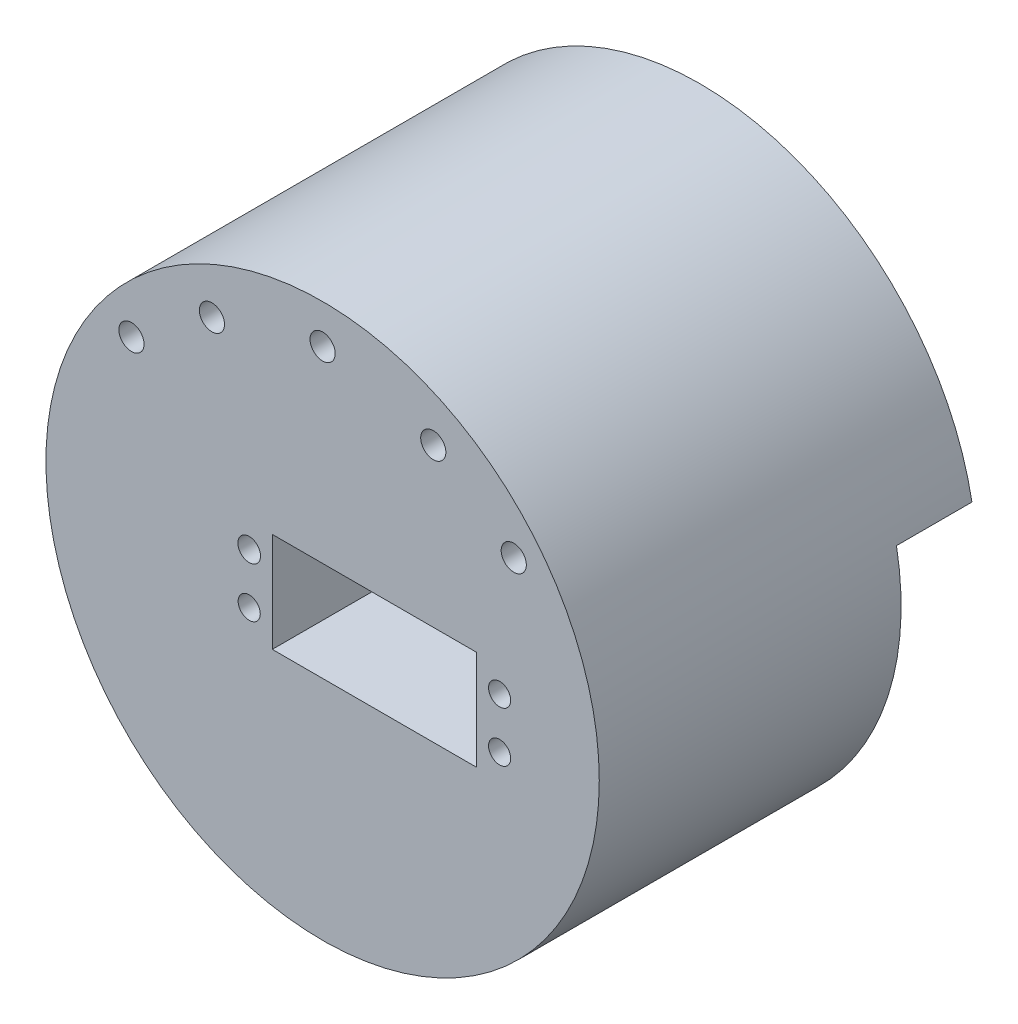
ISO-10303-21;
HEADER;
FILE_DESCRIPTION(('STEP AP214'),'2;1');
FILE_NAME('part.step','',(''),(''),'','','');
FILE_SCHEMA(('AUTOMOTIVE_DESIGN { 1 0 10303 214 1 1 1 1 }'));
ENDSEC;
DATA;
#1=APPLICATION_CONTEXT('core data for automotive mechanical design processes');
#2=APPLICATION_PROTOCOL_DEFINITION('international standard','automotive_design',2000,#1);
#3=PRODUCT_CONTEXT('',#1,'mechanical');
#4=PRODUCT('Part','Part','',(#3));
#5=PRODUCT_RELATED_PRODUCT_CATEGORY('part','',(#4));
#6=PRODUCT_DEFINITION_FORMATION('','',#4);
#7=PRODUCT_DEFINITION_CONTEXT('part definition',#1,'design');
#8=PRODUCT_DEFINITION('design','',#6,#7);
#9=PRODUCT_DEFINITION_SHAPE('','',#8);
#10=(LENGTH_UNIT() NAMED_UNIT(*) SI_UNIT(.MILLI.,.METRE.));
#11=(NAMED_UNIT(*) PLANE_ANGLE_UNIT() SI_UNIT($,.RADIAN.));
#12=(NAMED_UNIT(*) SI_UNIT($,.STERADIAN.) SOLID_ANGLE_UNIT());
#13=UNCERTAINTY_MEASURE_WITH_UNIT(LENGTH_MEASURE(1.E-05),#10,'distance_accuracy_value','');
#14=(GEOMETRIC_REPRESENTATION_CONTEXT(3) GLOBAL_UNCERTAINTY_ASSIGNED_CONTEXT((#13)) GLOBAL_UNIT_ASSIGNED_CONTEXT((#10,
#11,#12)) REPRESENTATION_CONTEXT('',''));
#15=CARTESIAN_POINT('',(0.,0.,0.));
#16=DIRECTION('',(0.,0.,1.));
#17=DIRECTION('',(1.,0.,0.));
#18=AXIS2_PLACEMENT_3D('',#15,#16,#17);
#19=CARTESIAN_POINT('',(942549.675832424,-334008.51299366,35.));
#20=CARTESIAN_POINT('',(-944927.541367444,327413.328964391,35.));
#21=CARTESIAN_POINT('',(947137.886004269,-320766.828871714,35.));
#22=B_SPLINE_CURVE_WITH_KNOTS('',2,(#19,#20,#21),.UNSPECIFIED.,.F.,.F.,(3,3),(0.,1.),.UNSPECIFIED.);
#23=DIRECTION('',(0.,0.,-1.));
#24=VECTOR('',#23,1.);
#25=SURFACE_OF_LINEAR_EXTRUSION('',#22,#24);
#26=CARTESIAN_POINT('',(942549.675832424,-334008.51299366,15.));
#27=CARTESIAN_POINT('',(-944927.541367444,327413.328964391,15.));
#28=CARTESIAN_POINT('',(947137.886004269,-320766.828871714,15.));
#29=B_SPLINE_CURVE_WITH_KNOTS('',2,(#26,#27,#28),.UNSPECIFIED.,.F.,.F.,(3,3),(0.,1.),.UNSPECIFIED.);
#30=CARTESIAN_POINT('',(-38.,20.,15.));
#31=VERTEX_POINT('',#30);
#32=CARTESIAN_POINT('',(-23.2669351516014,31.4997909151736,15.));
#33=VERTEX_POINT('',#32);
#34=EDGE_CURVE('E238',#31,#33,#29,.T.);
#35=ORIENTED_EDGE('',*,*,#34,.F.);
#36=DIRECTION('',(0.,0.,-1.));
#37=VECTOR('',#36,1.);
#38=CARTESIAN_POINT('',(-38.,20.,35.));
#39=LINE('',#38,#37);
#40=CARTESIAN_POINT('',(-38.,20.,0.));
#41=VERTEX_POINT('',#40);
#42=EDGE_CURVE('E274',#31,#41,#39,.T.);
#43=ORIENTED_EDGE('',*,*,#42,.T.);
#44=CARTESIAN_POINT('',(942549.675832424,-334008.51299366,0.));
#45=CARTESIAN_POINT('',(-944927.541367444,327413.328964391,0.));
#46=CARTESIAN_POINT('',(947137.886004269,-320766.828871714,0.));
#47=B_SPLINE_CURVE_WITH_KNOTS('',2,(#44,#45,#46),.UNSPECIFIED.,.F.,.F.,(3,3),(0.,1.),.UNSPECIFIED.);
#48=CARTESIAN_POINT('',(1.02495789633394E-09,39.5000000001549,0.));
#49=VERTEX_POINT('',#48);
#50=EDGE_CURVE('E275',#41,#49,#47,.T.);
#51=ORIENTED_EDGE('',*,*,#50,.T.);
#52=DIRECTION('',(0.,0.,-1.));
#53=VECTOR('',#52,1.);
#54=CARTESIAN_POINT('',(1.02495789633394E-09,39.5000000001549,35.));
#55=LINE('',#54,#53);
#56=CARTESIAN_POINT('',(9.33919608314682E-10,39.4999999998344,15.));
#57=VERTEX_POINT('',#56);
#58=EDGE_CURVE('E411',#57,#49,#55,.T.);
#59=ORIENTED_EDGE('',*,*,#58,.F.);
#60=CARTESIAN_POINT('',(-1.54866920763857,39.130406626226,15.));
#61=VERTEX_POINT('',#60);
#62=EDGE_CURVE('E243',#61,#57,#29,.T.);
#63=ORIENTED_EDGE('',*,*,#62,.F.);
#64=DIRECTION('',(0.,0.,-1.));
#65=VECTOR('',#64,1.);
#66=CARTESIAN_POINT('',(-1.54866920763874,39.1304066262304,35.));
#67=LINE('',#66,#65);
#68=CARTESIAN_POINT('',(-1.54866920760222,39.1304066262274,35.));
#69=VERTEX_POINT('',#68);
#70=EDGE_CURVE('E228',#69,#61,#67,.T.);
#71=ORIENTED_EDGE('',*,*,#70,.F.);
#72=CARTESIAN_POINT('',(-23.2669351515478,31.4997909152126,35.));
#73=VERTEX_POINT('',#72);
#74=EDGE_CURVE('E255',#73,#69,#22,.T.);
#75=ORIENTED_EDGE('',*,*,#74,.F.);
#76=DIRECTION('',(0.,0.,-1.));
#77=VECTOR('',#76,1.);
#78=CARTESIAN_POINT('',(-23.2669351516033,31.4997909151762,35.));
#79=LINE('',#78,#77);
#80=EDGE_CURVE('E230',#33,#73,#79,.F.);
#81=ORIENTED_EDGE('',*,*,#80,.F.);
#82=EDGE_LOOP('',(#35,#43,#51,#59,#63,#71,#75,#81));
#83=FACE_BOUND('',#82,.T.);
#84=ADVANCED_FACE('F37',(#83),#25,.F.);
#85=CARTESIAN_POINT('',(-947137.886004269,-320766.828871714,35.));
#86=CARTESIAN_POINT('',(944927.541367444,327413.328964391,35.));
#87=CARTESIAN_POINT('',(-942549.675832424,-334008.51299366,35.));
#88=B_SPLINE_CURVE_WITH_KNOTS('',2,(#85,#86,#87),.UNSPECIFIED.,.F.,.F.,(3,3),(0.,1.),.UNSPECIFIED.);
#89=DIRECTION('',(0.,0.,-1.));
#90=VECTOR('',#89,1.);
#91=SURFACE_OF_LINEAR_EXTRUSION('',#88,#90);
#92=CARTESIAN_POINT('',(-947137.886004269,-320766.828871714,15.));
#93=CARTESIAN_POINT('',(944927.541367444,327413.328964391,15.));
#94=CARTESIAN_POINT('',(-942549.675832424,-334008.51299366,15.));
#95=B_SPLINE_CURVE_WITH_KNOTS('',2,(#92,#93,#94),.UNSPECIFIED.,.F.,.F.,(3,3),(0.,1.),.UNSPECIFIED.);
#96=CARTESIAN_POINT('',(1.5486692083001,39.1304066261998,15.));
#97=VERTEX_POINT('',#96);
#98=EDGE_CURVE('E254',#57,#97,#95,.T.);
#99=ORIENTED_EDGE('',*,*,#98,.F.);
#100=ORIENTED_EDGE('',*,*,#58,.T.);
#101=CARTESIAN_POINT('',(-947137.886004269,-320766.828871714,0.));
#102=CARTESIAN_POINT('',(944927.541367444,327413.328964391,0.));
#103=CARTESIAN_POINT('',(-942549.675832424,-334008.51299366,0.));
#104=B_SPLINE_CURVE_WITH_KNOTS('',2,(#101,#102,#103),.UNSPECIFIED.,.F.,.F.,(3,3),(0.,1.),.UNSPECIFIED.);
#105=CARTESIAN_POINT('',(38.,20.,0.));
#106=VERTEX_POINT('',#105);
#107=EDGE_CURVE('E479',#49,#106,#104,.T.);
#108=ORIENTED_EDGE('',*,*,#107,.T.);
#109=DIRECTION('',(0.,0.,-1.));
#110=VECTOR('',#109,1.);
#111=CARTESIAN_POINT('',(38.,20.,35.));
#112=LINE('',#111,#110);
#113=CARTESIAN_POINT('',(38.,20.,15.));
#114=VERTEX_POINT('',#113);
#115=EDGE_CURVE('E409',#114,#106,#112,.T.);
#116=ORIENTED_EDGE('',*,*,#115,.F.);
#117=CARTESIAN_POINT('',(23.2669351509803,31.4997909156324,15.));
#118=VERTEX_POINT('',#117);
#119=EDGE_CURVE('E251',#118,#114,#95,.T.);
#120=ORIENTED_EDGE('',*,*,#119,.F.);
#121=DIRECTION('',(0.,0.,-1.));
#122=VECTOR('',#121,1.);
#123=CARTESIAN_POINT('',(23.2669351509771,31.499790915628,35.));
#124=LINE('',#123,#122);
#125=CARTESIAN_POINT('',(23.2669351510263,31.4997909155984,35.));
#126=VERTEX_POINT('',#125);
#127=EDGE_CURVE('E232',#126,#118,#124,.T.);
#128=ORIENTED_EDGE('',*,*,#127,.F.);
#129=CARTESIAN_POINT('',(1.54866920822509,39.1304066262028,35.));
#130=VERTEX_POINT('',#129);
#131=EDGE_CURVE('E264',#130,#126,#88,.T.);
#132=ORIENTED_EDGE('',*,*,#131,.F.);
#133=DIRECTION('',(0.,0.,-1.));
#134=VECTOR('',#133,1.);
#135=CARTESIAN_POINT('',(1.54866920829955,39.1304066261859,35.));
#136=LINE('',#135,#134);
#137=EDGE_CURVE('E234',#97,#130,#136,.F.);
#138=ORIENTED_EDGE('',*,*,#137,.F.);
#139=EDGE_LOOP('',(#99,#100,#108,#116,#120,#128,#132,#138));
#140=FACE_BOUND('',#139,.T.);
#141=ADVANCED_FACE('F282',(#140),#91,.F.);
#142=CARTESIAN_POINT('',(38.,0.,35.));
#143=DIRECTION('',(1.,0.,0.));
#144=DIRECTION('',(0.,1.,0.));
#145=AXIS2_PLACEMENT_3D('',#142,#143,#144);
#146=PLANE('',#145);
#147=DIRECTION('',(0.,-1.,0.));
#148=VECTOR('',#147,1.);
#149=CARTESIAN_POINT('',(38.,0.,15.));
#150=LINE('',#149,#148);
#151=CARTESIAN_POINT('',(38.,10.,15.));
#152=VERTEX_POINT('',#151);
#153=EDGE_CURVE('E249',#114,#152,#150,.T.);
#154=ORIENTED_EDGE('',*,*,#153,.F.);
#155=ORIENTED_EDGE('',*,*,#115,.T.);
#156=DIRECTION('',(0.,-1.,0.));
#157=VECTOR('',#156,1.);
#158=CARTESIAN_POINT('',(38.,0.,0.));
#159=LINE('',#158,#157);
#160=CARTESIAN_POINT('',(38.,10.,0.));
#161=VERTEX_POINT('',#160);
#162=EDGE_CURVE('E483',#106,#161,#159,.T.);
#163=ORIENTED_EDGE('',*,*,#162,.T.);
#164=DIRECTION('',(0.,0.,-1.));
#165=VECTOR('',#164,1.);
#166=CARTESIAN_POINT('',(38.,10.,35.));
#167=LINE('',#166,#165);
#168=EDGE_CURVE('E407',#152,#161,#167,.T.);
#169=ORIENTED_EDGE('',*,*,#168,.F.);
#170=EDGE_LOOP('',(#154,#155,#163,#169));
#171=FACE_BOUND('',#170,.T.);
#172=ADVANCED_FACE('F285',(#171),#146,.F.);
#173=CARTESIAN_POINT('',(0.,10.,35.));
#174=DIRECTION('',(0.,-1.,0.));
#175=DIRECTION('',(1.,0.,0.));
#176=AXIS2_PLACEMENT_3D('',#173,#174,#175);
#177=PLANE('',#176);
#178=DIRECTION('',(0.,0.,-1.));
#179=VECTOR('',#178,1.);
#180=CARTESIAN_POINT('',(54.0832691319598,10.,35.));
#181=LINE('',#180,#179);
#182=CARTESIAN_POINT('',(54.0832691319598,10.,15.));
#183=VERTEX_POINT('',#182);
#184=CARTESIAN_POINT('',(54.0832691319598,10.,0.));
#185=VERTEX_POINT('',#184);
#186=EDGE_CURVE('E405',#183,#185,#181,.T.);
#187=ORIENTED_EDGE('',*,*,#186,.F.);
#188=DIRECTION('',(-1.,0.,0.));
#189=VECTOR('',#188,1.);
#190=CARTESIAN_POINT('',(0.,10.,15.));
#191=LINE('',#190,#189);
#192=EDGE_CURVE('E242',#183,#152,#191,.T.);
#193=ORIENTED_EDGE('',*,*,#192,.T.);
#194=ORIENTED_EDGE('',*,*,#168,.T.);
#195=DIRECTION('',(-1.,0.,0.));
#196=VECTOR('',#195,1.);
#197=CARTESIAN_POINT('',(0.,10.,0.));
#198=LINE('',#197,#196);
#199=EDGE_CURVE('E487',#185,#161,#198,.T.);
#200=ORIENTED_EDGE('',*,*,#199,.F.);
#201=EDGE_LOOP('',(#187,#193,#194,#200));
#202=FACE_BOUND('',#201,.T.);
#203=ADVANCED_FACE('F289',(#202),#177,.T.);
#204=CARTESIAN_POINT('',(0.,10.,35.));
#205=DIRECTION('',(0.,1.,0.));
#206=DIRECTION('',(0.,0.,1.));
#207=AXIS2_PLACEMENT_3D('',#204,#205,#206);
#208=PLANE('',#207);
#209=DIRECTION('',(1.,0.,0.));
#210=VECTOR('',#209,1.);
#211=CARTESIAN_POINT('',(0.,10.,15.));
#212=LINE('',#211,#210);
#213=CARTESIAN_POINT('',(-54.0832691319598,10.,15.));
#214=VERTEX_POINT('',#213);
#215=CARTESIAN_POINT('',(-38.,10.,15.));
#216=VERTEX_POINT('',#215);
#217=EDGE_CURVE('E236',#214,#216,#212,.T.);
#218=ORIENTED_EDGE('',*,*,#217,.F.);
#219=DIRECTION('',(0.,0.,-1.));
#220=VECTOR('',#219,1.);
#221=CARTESIAN_POINT('',(-54.0832691319598,10.,35.));
#222=LINE('',#221,#220);
#223=CARTESIAN_POINT('',(-54.0832691319598,10.,0.));
#224=VERTEX_POINT('',#223);
#225=EDGE_CURVE('E399',#214,#224,#222,.T.);
#226=ORIENTED_EDGE('',*,*,#225,.T.);
#227=DIRECTION('',(1.,0.,0.));
#228=VECTOR('',#227,1.);
#229=CARTESIAN_POINT('',(0.,10.,0.));
#230=LINE('',#229,#228);
#231=CARTESIAN_POINT('',(-38.,10.,0.));
#232=VERTEX_POINT('',#231);
#233=EDGE_CURVE('E495',#224,#232,#230,.T.);
#234=ORIENTED_EDGE('',*,*,#233,.T.);
#235=DIRECTION('',(0.,0.,-1.));
#236=VECTOR('',#235,1.);
#237=CARTESIAN_POINT('',(-38.,10.,35.));
#238=LINE('',#237,#236);
#239=EDGE_CURVE('E397',#216,#232,#238,.T.);
#240=ORIENTED_EDGE('',*,*,#239,.F.);
#241=EDGE_LOOP('',(#218,#226,#234,#240));
#242=FACE_BOUND('',#241,.T.);
#243=ADVANCED_FACE('F293',(#242),#208,.F.);
#244=CARTESIAN_POINT('',(-38.,0.,35.));
#245=DIRECTION('',(-1.,0.,0.));
#246=DIRECTION('',(0.,0.,1.));
#247=AXIS2_PLACEMENT_3D('',#244,#245,#246);
#248=PLANE('',#247);
#249=DIRECTION('',(0.,1.,0.));
#250=VECTOR('',#249,1.);
#251=CARTESIAN_POINT('',(-38.,0.,15.));
#252=LINE('',#251,#250);
#253=EDGE_CURVE('E393',#216,#31,#252,.T.);
#254=ORIENTED_EDGE('',*,*,#253,.F.);
#255=ORIENTED_EDGE('',*,*,#239,.T.);
#256=DIRECTION('',(0.,1.,0.));
#257=VECTOR('',#256,1.);
#258=CARTESIAN_POINT('',(-38.,0.,0.));
#259=LINE('',#258,#257);
#260=EDGE_CURVE('E265',#232,#41,#259,.T.);
#261=ORIENTED_EDGE('',*,*,#260,.T.);
#262=ORIENTED_EDGE('',*,*,#42,.F.);
#263=EDGE_LOOP('',(#254,#255,#261,#262));
#264=FACE_BOUND('',#263,.T.);
#265=ADVANCED_FACE('F303',(#264),#248,.F.);
#266=CARTESIAN_POINT('',(0.,0.,35.));
#267=DIRECTION('',(0.,0.,1.));
#268=DIRECTION('',(1.,0.,0.));
#269=AXIS2_PLACEMENT_3D('',#266,#267,#268);
#270=PLANE('',#269);
#271=ORIENTED_EDGE('',*,*,#131,.T.);
#272=CARTESIAN_POINT('',(0.,0.,35.));
#273=DIRECTION('',(0.,0.,1.));
#274=DIRECTION('',(1.,0.,0.));
#275=AXIS2_PLACEMENT_3D('',#272,#273,#274);
#276=CIRCLE('',#275,39.1610405766813);
#277=EDGE_CURVE('E416',#126,#130,#276,.T.);
#278=ORIENTED_EDGE('',*,*,#277,.T.);
#279=EDGE_LOOP('',(#271,#278));
#280=FACE_BOUND('',#279,.T.);
#281=ADVANCED_FACE('F307',(#280),#270,.T.);
#282=ORIENTED_EDGE('',*,*,#74,.T.);
#283=EDGE_CURVE('E413',#69,#73,#276,.T.);
#284=ORIENTED_EDGE('',*,*,#283,.T.);
#285=EDGE_LOOP('',(#282,#284));
#286=FACE_BOUND('',#285,.T.);
#287=ADVANCED_FACE('F299',(#286),#270,.T.);
#288=CARTESIAN_POINT('',(0.,0.,35.));
#289=DIRECTION('',(0.,0.,-1.));
#290=DIRECTION('',(-1.,0.,0.));
#291=AXIS2_PLACEMENT_3D('',#288,#289,#290);
#292=CYLINDRICAL_SURFACE('',#291,55.);
#293=CARTESIAN_POINT('',(0.,0.,15.));
#294=DIRECTION('',(0.,0.,1.));
#295=DIRECTION('',(1.,0.,0.));
#296=AXIS2_PLACEMENT_3D('',#293,#294,#295);
#297=CIRCLE('',#296,55.);
#298=EDGE_CURVE('E225',#214,#183,#297,.T.);
#299=ORIENTED_EDGE('',*,*,#298,.T.);
#300=ORIENTED_EDGE('',*,*,#186,.T.);
#301=CARTESIAN_POINT('',(0.,0.,0.));
#302=DIRECTION('',(0.,0.,1.));
#303=DIRECTION('',(1.,0.,0.));
#304=AXIS2_PLACEMENT_3D('',#301,#302,#303);
#305=CIRCLE('',#304,55.);
#306=EDGE_CURVE('E491',#185,#224,#305,.T.);
#307=ORIENTED_EDGE('',*,*,#306,.T.);
#308=ORIENTED_EDGE('',*,*,#225,.F.);
#309=EDGE_LOOP('',(#299,#300,#307,#308));
#310=FACE_BOUND('',#309,.T.);
#311=CARTESIAN_POINT('',(0.,0.,75.));
#312=DIRECTION('',(0.,0.,1.));
#313=DIRECTION('',(1.,0.,0.));
#314=AXIS2_PLACEMENT_3D('',#311,#312,#313);
#315=CIRCLE('',#314,55.);
#316=CARTESIAN_POINT('',(55.,0.,75.));
#317=VERTEX_POINT('',#316);
#318=EDGE_CURVE('E213',#317,#317,#315,.T.);
#319=ORIENTED_EDGE('',*,*,#318,.F.);
#320=EDGE_LOOP('',(#319));
#321=FACE_BOUND('',#320,.T.);
#322=ADVANCED_FACE('F295',(#310,#321),#292,.T.);
#323=CARTESIAN_POINT('',(0.,0.,0.));
#324=DIRECTION('',(0.,0.,1.));
#325=DIRECTION('',(1.,0.,0.));
#326=AXIS2_PLACEMENT_3D('',#323,#324,#325);
#327=PLANE('',#326);
#328=CARTESIAN_POINT('',(-22.,41.2665083559999,0.));
#329=DIRECTION('',(0.,0.,1.));
#330=DIRECTION('',(1.,0.,0.));
#331=AXIS2_PLACEMENT_3D('',#328,#329,#330);
#332=CIRCLE('',#331,2.5);
#333=CARTESIAN_POINT('',(-19.5,41.2665083559999,0.));
#334=VERTEX_POINT('',#333);
#335=EDGE_CURVE('E185',#334,#334,#332,.T.);
#336=ORIENTED_EDGE('',*,*,#335,.T.);
#337=EDGE_LOOP('',(#336));
#338=FACE_BOUND('',#337,.T.);
#339=CARTESIAN_POINT('',(0.,47.25,0.));
#340=DIRECTION('',(0.,0.,1.));
#341=DIRECTION('',(1.,0.,0.));
#342=AXIS2_PLACEMENT_3D('',#339,#340,#341);
#343=CIRCLE('',#342,2.5);
#344=CARTESIAN_POINT('',(2.50000000000001,47.25,0.));
#345=VERTEX_POINT('',#344);
#346=EDGE_CURVE('E192',#345,#345,#343,.T.);
#347=ORIENTED_EDGE('',*,*,#346,.T.);
#348=EDGE_LOOP('',(#347));
#349=FACE_BOUND('',#348,.T.);
#350=CARTESIAN_POINT('',(22.,41.2665083559999,0.));
#351=DIRECTION('',(0.,0.,1.));
#352=DIRECTION('',(1.,0.,0.));
#353=AXIS2_PLACEMENT_3D('',#350,#351,#352);
#354=CIRCLE('',#353,2.5);
#355=CARTESIAN_POINT('',(24.5,41.2665083559999,0.));
#356=VERTEX_POINT('',#355);
#357=EDGE_CURVE('E198',#356,#356,#354,.T.);
#358=ORIENTED_EDGE('',*,*,#357,.T.);
#359=EDGE_LOOP('',(#358));
#360=FACE_BOUND('',#359,.T.);
#361=CARTESIAN_POINT('',(38.,29.880895352071,0.));
#362=DIRECTION('',(0.,0.,1.));
#363=DIRECTION('',(1.,0.,0.));
#364=AXIS2_PLACEMENT_3D('',#361,#362,#363);
#365=CIRCLE('',#364,2.5);
#366=CARTESIAN_POINT('',(40.5,29.880895352071,0.));
#367=VERTEX_POINT('',#366);
#368=EDGE_CURVE('E204',#367,#367,#365,.T.);
#369=ORIENTED_EDGE('',*,*,#368,.T.);
#370=EDGE_LOOP('',(#369));
#371=FACE_BOUND('',#370,.T.);
#372=CARTESIAN_POINT('',(-38.,29.8808953520711,0.));
#373=DIRECTION('',(0.,0.,1.));
#374=DIRECTION('',(1.,0.,0.));
#375=AXIS2_PLACEMENT_3D('',#372,#373,#374);
#376=CIRCLE('',#375,2.5);
#377=CARTESIAN_POINT('',(-35.5,29.8808953520711,0.));
#378=VERTEX_POINT('',#377);
#379=EDGE_CURVE('E210',#378,#378,#376,.T.);
#380=ORIENTED_EDGE('',*,*,#379,.T.);
#381=EDGE_LOOP('',(#380));
#382=FACE_BOUND('',#381,.T.);
#383=ORIENTED_EDGE('',*,*,#50,.F.);
#384=ORIENTED_EDGE('',*,*,#260,.F.);
#385=ORIENTED_EDGE('',*,*,#233,.F.);
#386=ORIENTED_EDGE('',*,*,#306,.F.);
#387=ORIENTED_EDGE('',*,*,#199,.T.);
#388=ORIENTED_EDGE('',*,*,#162,.F.);
#389=ORIENTED_EDGE('',*,*,#107,.F.);
#390=EDGE_LOOP('',(#383,#384,#385,#386,#387,#388,#389));
#391=FACE_BOUND('',#390,.T.);
#392=ADVANCED_FACE('F298',(#338,#349,#360,#371,#382,#391),#327,.F.);
#393=CARTESIAN_POINT('',(0.,0.,15.));
#394=DIRECTION('',(0.,0.,1.));
#395=DIRECTION('',(1.,0.,0.));
#396=AXIS2_PLACEMENT_3D('',#393,#394,#395);
#397=PLANE('',#396);
#398=CARTESIAN_POINT('',(0.,0.,15.));
#399=DIRECTION('',(0.,0.,1.));
#400=DIRECTION('',(1.,0.,0.));
#401=AXIS2_PLACEMENT_3D('',#398,#399,#400);
#402=CIRCLE('',#401,39.1610405766813);
#403=EDGE_CURVE('E224',#97,#61,#402,.T.);
#404=ORIENTED_EDGE('',*,*,#403,.T.);
#405=ORIENTED_EDGE('',*,*,#62,.T.);
#406=ORIENTED_EDGE('',*,*,#98,.T.);
#407=EDGE_LOOP('',(#404,#405,#406));
#408=FACE_BOUND('',#407,.T.);
#409=ADVANCED_FACE('F311',(#408),#397,.F.);
#410=EDGE_CURVE('E221',#33,#118,#402,.T.);
#411=ORIENTED_EDGE('',*,*,#410,.T.);
#412=ORIENTED_EDGE('',*,*,#119,.T.);
#413=ORIENTED_EDGE('',*,*,#153,.T.);
#414=ORIENTED_EDGE('',*,*,#192,.F.);
#415=ORIENTED_EDGE('',*,*,#298,.F.);
#416=ORIENTED_EDGE('',*,*,#217,.T.);
#417=ORIENTED_EDGE('',*,*,#253,.T.);
#418=ORIENTED_EDGE('',*,*,#34,.T.);
#419=EDGE_LOOP('',(#411,#412,#413,#414,#415,#416,#417,#418));
#420=FACE_BOUND('',#419,.T.);
#421=ADVANCED_FACE('F318',(#420),#397,.F.);
#422=CARTESIAN_POINT('',(0.,0.,15.));
#423=DIRECTION('',(0.,0.,1.));
#424=DIRECTION('',(1.,0.,0.));
#425=AXIS2_PLACEMENT_3D('',#422,#423,#424);
#426=CYLINDRICAL_SURFACE('',#425,39.1610405766813);
#427=CARTESIAN_POINT('',(0.,0.,55.));
#428=DIRECTION('',(0.,0.,1.));
#429=DIRECTION('',(1.,0.,0.));
#430=AXIS2_PLACEMENT_3D('',#427,#428,#429);
#431=CIRCLE('',#430,39.1610405766813);
#432=CARTESIAN_POINT('',(39.1610405766813,0.,55.));
#433=VERTEX_POINT('',#432);
#434=EDGE_CURVE('E218',#433,#433,#431,.F.);
#435=ORIENTED_EDGE('',*,*,#434,.F.);
#436=EDGE_LOOP('',(#435));
#437=FACE_BOUND('',#436,.T.);
#438=ORIENTED_EDGE('',*,*,#403,.F.);
#439=ORIENTED_EDGE('',*,*,#137,.T.);
#440=ORIENTED_EDGE('',*,*,#277,.F.);
#441=ORIENTED_EDGE('',*,*,#127,.T.);
#442=ORIENTED_EDGE('',*,*,#410,.F.);
#443=ORIENTED_EDGE('',*,*,#80,.T.);
#444=ORIENTED_EDGE('',*,*,#283,.F.);
#445=ORIENTED_EDGE('',*,*,#70,.T.);
#446=EDGE_LOOP('',(#438,#439,#440,#441,#442,#443,#444,#445));
#447=FACE_BOUND('',#446,.T.);
#448=ADVANCED_FACE('F320',(#437,#447),#426,.F.);
#449=CARTESIAN_POINT('',(0.,0.,75.));
#450=DIRECTION('',(0.,0.,1.));
#451=DIRECTION('',(1.,0.,0.));
#452=AXIS2_PLACEMENT_3D('',#449,#450,#451);
#453=PLANE('',#452);
#454=DIRECTION('',(0.,-1.,0.));
#455=VECTOR('',#454,1.);
#456=CARTESIAN_POINT('',(-9.99999999999999,9.9,75.));
#457=LINE('',#456,#455);
#458=CARTESIAN_POINT('',(-9.99999999999999,9.9,75.));
#459=VERTEX_POINT('',#458);
#460=CARTESIAN_POINT('',(-9.99999999999999,-9.89589611230524,75.));
#461=VERTEX_POINT('',#460);
#462=EDGE_CURVE('E52',#459,#461,#457,.T.);
#463=ORIENTED_EDGE('',*,*,#462,.F.);
#464=DIRECTION('',(-1.,0.,0.));
#465=VECTOR('',#464,1.);
#466=CARTESIAN_POINT('',(-9.99999999999999,9.9,75.));
#467=LINE('',#466,#465);
#468=CARTESIAN_POINT('',(30.5962747258083,9.9,75.));
#469=VERTEX_POINT('',#468);
#470=EDGE_CURVE('E163',#469,#459,#467,.T.);
#471=ORIENTED_EDGE('',*,*,#470,.F.);
#472=DIRECTION('',(0.,1.,0.));
#473=VECTOR('',#472,1.);
#474=CARTESIAN_POINT('',(30.5962747258083,9.9,75.));
#475=LINE('',#474,#473);
#476=CARTESIAN_POINT('',(30.5962747258083,-9.89589611230524,75.));
#477=VERTEX_POINT('',#476);
#478=EDGE_CURVE('E147',#477,#469,#475,.T.);
#479=ORIENTED_EDGE('',*,*,#478,.F.);
#480=DIRECTION('',(1.,0.,0.));
#481=VECTOR('',#480,1.);
#482=CARTESIAN_POINT('',(-9.99999999999999,-9.89589611230524,75.));
#483=LINE('',#482,#481);
#484=EDGE_CURVE('E156',#461,#477,#483,.T.);
#485=ORIENTED_EDGE('',*,*,#484,.F.);
#486=EDGE_LOOP('',(#463,#471,#479,#485));
#487=FACE_BOUND('',#486,.T.);
#488=CARTESIAN_POINT('',(35.1896133009768,-5.00000000000001,75.));
#489=DIRECTION('',(0.,0.,1.));
#490=DIRECTION('',(1.,0.,0.));
#491=AXIS2_PLACEMENT_3D('',#488,#489,#490);
#492=CIRCLE('',#491,2.2);
#493=CARTESIAN_POINT('',(37.3896133009768,-5.00000000000001,75.));
#494=VERTEX_POINT('',#493);
#495=EDGE_CURVE('E170',#494,#494,#492,.T.);
#496=ORIENTED_EDGE('',*,*,#495,.F.);
#497=EDGE_LOOP('',(#496));
#498=FACE_BOUND('',#497,.T.);
#499=CARTESIAN_POINT('',(35.1896133009768,4.99999999999999,75.));
#500=DIRECTION('',(0.,0.,1.));
#501=DIRECTION('',(1.,0.,0.));
#502=AXIS2_PLACEMENT_3D('',#499,#500,#501);
#503=CIRCLE('',#502,2.20000000000001);
#504=CARTESIAN_POINT('',(37.3896133009768,4.99999999999999,75.));
#505=VERTEX_POINT('',#504);
#506=EDGE_CURVE('E177',#505,#505,#503,.T.);
#507=ORIENTED_EDGE('',*,*,#506,.F.);
#508=EDGE_LOOP('',(#507));
#509=FACE_BOUND('',#508,.T.);
#510=CARTESIAN_POINT('',(-14.5896133009768,-4.99999999999999,75.));
#511=DIRECTION('',(0.,0.,1.));
#512=DIRECTION('',(1.,0.,0.));
#513=AXIS2_PLACEMENT_3D('',#510,#511,#512);
#514=CIRCLE('',#513,2.2);
#515=CARTESIAN_POINT('',(-12.3896133009768,-4.99999999999999,75.));
#516=VERTEX_POINT('',#515);
#517=EDGE_CURVE('E173',#516,#516,#514,.T.);
#518=ORIENTED_EDGE('',*,*,#517,.F.);
#519=EDGE_LOOP('',(#518));
#520=FACE_BOUND('',#519,.T.);
#521=CARTESIAN_POINT('',(-14.5896133009768,5.00000000000001,75.));
#522=DIRECTION('',(0.,0.,1.));
#523=DIRECTION('',(1.,0.,0.));
#524=AXIS2_PLACEMENT_3D('',#521,#522,#523);
#525=CIRCLE('',#524,2.25);
#526=CARTESIAN_POINT('',(-12.3396133009768,5.00000000000001,75.));
#527=VERTEX_POINT('',#526);
#528=EDGE_CURVE('E180',#527,#527,#525,.T.);
#529=ORIENTED_EDGE('',*,*,#528,.F.);
#530=EDGE_LOOP('',(#529));
#531=FACE_BOUND('',#530,.T.);
#532=CARTESIAN_POINT('',(-22.,41.2665083559999,75.));
#533=DIRECTION('',(0.,0.,1.));
#534=DIRECTION('',(1.,0.,0.));
#535=AXIS2_PLACEMENT_3D('',#532,#533,#534);
#536=CIRCLE('',#535,2.5);
#537=CARTESIAN_POINT('',(-19.5,41.2665083559999,75.));
#538=VERTEX_POINT('',#537);
#539=EDGE_CURVE('E189',#538,#538,#536,.T.);
#540=ORIENTED_EDGE('',*,*,#539,.F.);
#541=EDGE_LOOP('',(#540));
#542=FACE_BOUND('',#541,.T.);
#543=CARTESIAN_POINT('',(0.,47.25,75.));
#544=DIRECTION('',(0.,0.,1.));
#545=DIRECTION('',(1.,0.,0.));
#546=AXIS2_PLACEMENT_3D('',#543,#544,#545);
#547=CIRCLE('',#546,2.5);
#548=CARTESIAN_POINT('',(2.50000000000001,47.25,75.));
#549=VERTEX_POINT('',#548);
#550=EDGE_CURVE('E195',#549,#549,#547,.T.);
#551=ORIENTED_EDGE('',*,*,#550,.F.);
#552=EDGE_LOOP('',(#551));
#553=FACE_BOUND('',#552,.T.);
#554=CARTESIAN_POINT('',(22.,41.2665083559999,75.));
#555=DIRECTION('',(0.,0.,1.));
#556=DIRECTION('',(1.,0.,0.));
#557=AXIS2_PLACEMENT_3D('',#554,#555,#556);
#558=CIRCLE('',#557,2.5);
#559=CARTESIAN_POINT('',(24.5,41.2665083559999,75.));
#560=VERTEX_POINT('',#559);
#561=EDGE_CURVE('E201',#560,#560,#558,.T.);
#562=ORIENTED_EDGE('',*,*,#561,.F.);
#563=EDGE_LOOP('',(#562));
#564=FACE_BOUND('',#563,.T.);
#565=CARTESIAN_POINT('',(38.,29.880895352071,75.));
#566=DIRECTION('',(0.,0.,1.));
#567=DIRECTION('',(1.,0.,0.));
#568=AXIS2_PLACEMENT_3D('',#565,#566,#567);
#569=CIRCLE('',#568,2.5);
#570=CARTESIAN_POINT('',(40.5,29.880895352071,75.));
#571=VERTEX_POINT('',#570);
#572=EDGE_CURVE('E207',#571,#571,#569,.T.);
#573=ORIENTED_EDGE('',*,*,#572,.F.);
#574=EDGE_LOOP('',(#573));
#575=FACE_BOUND('',#574,.T.);
#576=CARTESIAN_POINT('',(-38.,29.8808953520711,75.));
#577=DIRECTION('',(0.,0.,1.));
#578=DIRECTION('',(1.,0.,0.));
#579=AXIS2_PLACEMENT_3D('',#576,#577,#578);
#580=CIRCLE('',#579,2.5);
#581=CARTESIAN_POINT('',(-35.5,29.8808953520711,75.));
#582=VERTEX_POINT('',#581);
#583=EDGE_CURVE('E188',#582,#582,#580,.T.);
#584=ORIENTED_EDGE('',*,*,#583,.F.);
#585=EDGE_LOOP('',(#584));
#586=FACE_BOUND('',#585,.T.);
#587=ORIENTED_EDGE('',*,*,#318,.T.);
#588=EDGE_LOOP('',(#587));
#589=FACE_BOUND('',#588,.T.);
#590=ADVANCED_FACE('F160',(#487,#498,#509,#520,#531,#542,#553,#564,#575,#586,#589),#453,.T.);
#591=CARTESIAN_POINT('',(0.,0.,55.));
#592=DIRECTION('',(0.,0.,1.));
#593=DIRECTION('',(1.,0.,0.));
#594=AXIS2_PLACEMENT_3D('',#591,#592,#593);
#595=PLANE('',#594);
#596=DIRECTION('',(-1.,0.,0.));
#597=VECTOR('',#596,1.);
#598=CARTESIAN_POINT('',(0.,9.9,55.));
#599=LINE('',#598,#597);
#600=CARTESIAN_POINT('',(30.5962747258083,9.9,55.));
#601=VERTEX_POINT('',#600);
#602=CARTESIAN_POINT('',(-9.99999999999999,9.9,55.));
#603=VERTEX_POINT('',#602);
#604=EDGE_CURVE('E45',#601,#603,#599,.T.);
#605=ORIENTED_EDGE('',*,*,#604,.T.);
#606=DIRECTION('',(0.,-1.,0.));
#607=VECTOR('',#606,1.);
#608=CARTESIAN_POINT('',(-9.99999999999999,0.,55.));
#609=LINE('',#608,#607);
#610=CARTESIAN_POINT('',(-9.99999999999999,-9.89589611230524,55.));
#611=VERTEX_POINT('',#610);
#612=EDGE_CURVE('E11',#603,#611,#609,.T.);
#613=ORIENTED_EDGE('',*,*,#612,.T.);
#614=DIRECTION('',(1.,0.,0.));
#615=VECTOR('',#614,1.);
#616=CARTESIAN_POINT('',(0.,-9.89589611230524,55.));
#617=LINE('',#616,#615);
#618=CARTESIAN_POINT('',(30.5962747258083,-9.89589611230524,55.));
#619=VERTEX_POINT('',#618);
#620=EDGE_CURVE('E418',#611,#619,#617,.T.);
#621=ORIENTED_EDGE('',*,*,#620,.T.);
#622=DIRECTION('',(0.,1.,0.));
#623=VECTOR('',#622,1.);
#624=CARTESIAN_POINT('',(30.5962747258083,0.,55.));
#625=LINE('',#624,#623);
#626=EDGE_CURVE('E150',#619,#601,#625,.T.);
#627=ORIENTED_EDGE('',*,*,#626,.T.);
#628=EDGE_LOOP('',(#605,#613,#621,#627));
#629=FACE_BOUND('',#628,.T.);
#630=CARTESIAN_POINT('',(35.1896133009768,-5.00000000000001,55.));
#631=DIRECTION('',(0.,0.,1.));
#632=DIRECTION('',(1.,0.,0.));
#633=AXIS2_PLACEMENT_3D('',#630,#631,#632);
#634=CIRCLE('',#633,2.2);
#635=CARTESIAN_POINT('',(37.3896133009768,-5.00000000000001,55.));
#636=VERTEX_POINT('',#635);
#637=EDGE_CURVE('E184',#636,#636,#634,.T.);
#638=ORIENTED_EDGE('',*,*,#637,.T.);
#639=EDGE_LOOP('',(#638));
#640=FACE_BOUND('',#639,.T.);
#641=CARTESIAN_POINT('',(35.1896133009768,4.99999999999999,55.));
#642=DIRECTION('',(0.,0.,1.));
#643=DIRECTION('',(1.,0.,0.));
#644=AXIS2_PLACEMENT_3D('',#641,#642,#643);
#645=CIRCLE('',#644,2.20000000000001);
#646=CARTESIAN_POINT('',(37.3896133009768,4.99999999999999,55.));
#647=VERTEX_POINT('',#646);
#648=EDGE_CURVE('E423',#647,#647,#645,.T.);
#649=ORIENTED_EDGE('',*,*,#648,.T.);
#650=EDGE_LOOP('',(#649));
#651=FACE_BOUND('',#650,.T.);
#652=CARTESIAN_POINT('',(-14.5896133009768,-4.99999999999999,55.));
#653=DIRECTION('',(0.,0.,1.));
#654=DIRECTION('',(1.,0.,0.));
#655=AXIS2_PLACEMENT_3D('',#652,#653,#654);
#656=CIRCLE('',#655,2.2);
#657=CARTESIAN_POINT('',(-12.3896133009768,-4.99999999999999,55.));
#658=VERTEX_POINT('',#657);
#659=EDGE_CURVE('E176',#658,#658,#656,.T.);
#660=ORIENTED_EDGE('',*,*,#659,.T.);
#661=EDGE_LOOP('',(#660));
#662=FACE_BOUND('',#661,.T.);
#663=CARTESIAN_POINT('',(-14.5896133009768,5.00000000000001,55.));
#664=DIRECTION('',(0.,0.,1.));
#665=DIRECTION('',(1.,0.,0.));
#666=AXIS2_PLACEMENT_3D('',#663,#664,#665);
#667=CIRCLE('',#666,2.25);
#668=CARTESIAN_POINT('',(-12.3396133009768,5.00000000000001,55.));
#669=VERTEX_POINT('',#668);
#670=EDGE_CURVE('E183',#669,#669,#667,.T.);
#671=ORIENTED_EDGE('',*,*,#670,.T.);
#672=EDGE_LOOP('',(#671));
#673=FACE_BOUND('',#672,.T.);
#674=ORIENTED_EDGE('',*,*,#434,.T.);
#675=EDGE_LOOP('',(#674));
#676=FACE_BOUND('',#675,.T.);
#677=ADVANCED_FACE('F324',(#629,#640,#651,#662,#673,#676),#595,.F.);
#678=CARTESIAN_POINT('',(-38.,29.8808953520711,0.));
#679=DIRECTION('',(0.,0.,1.));
#680=DIRECTION('',(1.,0.,0.));
#681=AXIS2_PLACEMENT_3D('',#678,#679,#680);
#682=CYLINDRICAL_SURFACE('',#681,2.5);
#683=ORIENTED_EDGE('',*,*,#379,.F.);
#684=EDGE_LOOP('',(#683));
#685=FACE_BOUND('',#684,.T.);
#686=ORIENTED_EDGE('',*,*,#583,.T.);
#687=EDGE_LOOP('',(#686));
#688=FACE_BOUND('',#687,.T.);
#689=ADVANCED_FACE('F327',(#685,#688),#682,.F.);
#690=CARTESIAN_POINT('',(38.,29.880895352071,0.));
#691=DIRECTION('',(0.,0.,1.));
#692=DIRECTION('',(1.,0.,0.));
#693=AXIS2_PLACEMENT_3D('',#690,#691,#692);
#694=CYLINDRICAL_SURFACE('',#693,2.5);
#695=ORIENTED_EDGE('',*,*,#368,.F.);
#696=EDGE_LOOP('',(#695));
#697=FACE_BOUND('',#696,.T.);
#698=ORIENTED_EDGE('',*,*,#572,.T.);
#699=EDGE_LOOP('',(#698));
#700=FACE_BOUND('',#699,.T.);
#701=ADVANCED_FACE('F333',(#697,#700),#694,.F.);
#702=CARTESIAN_POINT('',(22.,41.2665083559999,0.));
#703=DIRECTION('',(0.,0.,1.));
#704=DIRECTION('',(1.,0.,0.));
#705=AXIS2_PLACEMENT_3D('',#702,#703,#704);
#706=CYLINDRICAL_SURFACE('',#705,2.5);
#707=ORIENTED_EDGE('',*,*,#357,.F.);
#708=EDGE_LOOP('',(#707));
#709=FACE_BOUND('',#708,.T.);
#710=ORIENTED_EDGE('',*,*,#561,.T.);
#711=EDGE_LOOP('',(#710));
#712=FACE_BOUND('',#711,.T.);
#713=ADVANCED_FACE('F337',(#709,#712),#706,.F.);
#714=CARTESIAN_POINT('',(0.,47.25,0.));
#715=DIRECTION('',(0.,0.,1.));
#716=DIRECTION('',(1.,0.,0.));
#717=AXIS2_PLACEMENT_3D('',#714,#715,#716);
#718=CYLINDRICAL_SURFACE('',#717,2.5);
#719=ORIENTED_EDGE('',*,*,#346,.F.);
#720=EDGE_LOOP('',(#719));
#721=FACE_BOUND('',#720,.T.);
#722=ORIENTED_EDGE('',*,*,#550,.T.);
#723=EDGE_LOOP('',(#722));
#724=FACE_BOUND('',#723,.T.);
#725=ADVANCED_FACE('F341',(#721,#724),#718,.F.);
#726=CARTESIAN_POINT('',(-22.,41.2665083559999,0.));
#727=DIRECTION('',(0.,0.,1.));
#728=DIRECTION('',(1.,0.,0.));
#729=AXIS2_PLACEMENT_3D('',#726,#727,#728);
#730=CYLINDRICAL_SURFACE('',#729,2.5);
#731=ORIENTED_EDGE('',*,*,#335,.F.);
#732=EDGE_LOOP('',(#731));
#733=FACE_BOUND('',#732,.T.);
#734=ORIENTED_EDGE('',*,*,#539,.T.);
#735=EDGE_LOOP('',(#734));
#736=FACE_BOUND('',#735,.T.);
#737=ADVANCED_FACE('F345',(#733,#736),#730,.F.);
#738=CARTESIAN_POINT('',(-14.5896133009768,5.00000000000001,45.));
#739=DIRECTION('',(0.,0.,1.));
#740=DIRECTION('',(1.,0.,0.));
#741=AXIS2_PLACEMENT_3D('',#738,#739,#740);
#742=CYLINDRICAL_SURFACE('',#741,2.25);
#743=ORIENTED_EDGE('',*,*,#528,.T.);
#744=EDGE_LOOP('',(#743));
#745=FACE_BOUND('',#744,.T.);
#746=ORIENTED_EDGE('',*,*,#670,.F.);
#747=EDGE_LOOP('',(#746));
#748=FACE_BOUND('',#747,.T.);
#749=ADVANCED_FACE('F349',(#745,#748),#742,.F.);
#750=CARTESIAN_POINT('',(-14.5896133009768,-4.99999999999999,45.));
#751=DIRECTION('',(0.,0.,1.));
#752=DIRECTION('',(1.,0.,0.));
#753=AXIS2_PLACEMENT_3D('',#750,#751,#752);
#754=CYLINDRICAL_SURFACE('',#753,2.2);
#755=ORIENTED_EDGE('',*,*,#517,.T.);
#756=EDGE_LOOP('',(#755));
#757=FACE_BOUND('',#756,.T.);
#758=ORIENTED_EDGE('',*,*,#659,.F.);
#759=EDGE_LOOP('',(#758));
#760=FACE_BOUND('',#759,.T.);
#761=ADVANCED_FACE('F353',(#757,#760),#754,.F.);
#762=CARTESIAN_POINT('',(35.1896133009768,4.99999999999999,45.));
#763=DIRECTION('',(0.,0.,1.));
#764=DIRECTION('',(1.,0.,0.));
#765=AXIS2_PLACEMENT_3D('',#762,#763,#764);
#766=CYLINDRICAL_SURFACE('',#765,2.20000000000001);
#767=ORIENTED_EDGE('',*,*,#506,.T.);
#768=EDGE_LOOP('',(#767));
#769=FACE_BOUND('',#768,.T.);
#770=ORIENTED_EDGE('',*,*,#648,.F.);
#771=EDGE_LOOP('',(#770));
#772=FACE_BOUND('',#771,.T.);
#773=ADVANCED_FACE('F355',(#769,#772),#766,.F.);
#774=CARTESIAN_POINT('',(35.1896133009768,-5.00000000000001,45.));
#775=DIRECTION('',(0.,0.,1.));
#776=DIRECTION('',(1.,0.,0.));
#777=AXIS2_PLACEMENT_3D('',#774,#775,#776);
#778=CYLINDRICAL_SURFACE('',#777,2.2);
#779=ORIENTED_EDGE('',*,*,#495,.T.);
#780=EDGE_LOOP('',(#779));
#781=FACE_BOUND('',#780,.T.);
#782=ORIENTED_EDGE('',*,*,#637,.F.);
#783=EDGE_LOOP('',(#782));
#784=FACE_BOUND('',#783,.T.);
#785=ADVANCED_FACE('F358',(#781,#784),#778,.F.);
#786=CARTESIAN_POINT('',(-9.99999999999999,9.9,45.));
#787=DIRECTION('',(-1.,0.,0.));
#788=DIRECTION('',(0.,0.,1.));
#789=AXIS2_PLACEMENT_3D('',#786,#787,#788);
#790=PLANE('',#789);
#791=DIRECTION('',(0.,0.,1.));
#792=VECTOR('',#791,1.);
#793=CARTESIAN_POINT('',(-9.99999999999999,9.9,45.));
#794=LINE('',#793,#792);
#795=EDGE_CURVE('E168',#603,#459,#794,.T.);
#796=ORIENTED_EDGE('',*,*,#795,.T.);
#797=ORIENTED_EDGE('',*,*,#462,.T.);
#798=DIRECTION('',(0.,0.,1.));
#799=VECTOR('',#798,1.);
#800=CARTESIAN_POINT('',(-9.99999999999999,-9.89589611230524,45.));
#801=LINE('',#800,#799);
#802=EDGE_CURVE('E153',#611,#461,#801,.T.);
#803=ORIENTED_EDGE('',*,*,#802,.F.);
#804=ORIENTED_EDGE('',*,*,#612,.F.);
#805=EDGE_LOOP('',(#796,#797,#803,#804));
#806=FACE_BOUND('',#805,.T.);
#807=ADVANCED_FACE('F363',(#806),#790,.F.);
#808=CARTESIAN_POINT('',(-9.99999999999999,9.9,45.));
#809=DIRECTION('',(0.,1.,0.));
#810=DIRECTION('',(0.,0.,1.));
#811=AXIS2_PLACEMENT_3D('',#808,#809,#810);
#812=PLANE('',#811);
#813=DIRECTION('',(0.,0.,1.));
#814=VECTOR('',#813,1.);
#815=CARTESIAN_POINT('',(30.5962747258083,9.9,45.));
#816=LINE('',#815,#814);
#817=EDGE_CURVE('E152',#601,#469,#816,.T.);
#818=ORIENTED_EDGE('',*,*,#817,.T.);
#819=ORIENTED_EDGE('',*,*,#470,.T.);
#820=ORIENTED_EDGE('',*,*,#795,.F.);
#821=ORIENTED_EDGE('',*,*,#604,.F.);
#822=EDGE_LOOP('',(#818,#819,#820,#821));
#823=FACE_BOUND('',#822,.T.);
#824=ADVANCED_FACE('F366',(#823),#812,.F.);
#825=CARTESIAN_POINT('',(30.5962747258083,9.9,45.));
#826=DIRECTION('',(1.,0.,0.));
#827=DIRECTION('',(0.,0.,-1.));
#828=AXIS2_PLACEMENT_3D('',#825,#826,#827);
#829=PLANE('',#828);
#830=DIRECTION('',(0.,0.,1.));
#831=VECTOR('',#830,1.);
#832=CARTESIAN_POINT('',(30.5962747258083,-9.89589611230524,45.));
#833=LINE('',#832,#831);
#834=EDGE_CURVE('E60',#619,#477,#833,.T.);
#835=ORIENTED_EDGE('',*,*,#834,.T.);
#836=ORIENTED_EDGE('',*,*,#478,.T.);
#837=ORIENTED_EDGE('',*,*,#817,.F.);
#838=ORIENTED_EDGE('',*,*,#626,.F.);
#839=EDGE_LOOP('',(#835,#836,#837,#838));
#840=FACE_BOUND('',#839,.T.);
#841=ADVANCED_FACE('F144',(#840),#829,.F.);
#842=CARTESIAN_POINT('',(-9.99999999999999,-9.89589611230524,45.));
#843=DIRECTION('',(0.,-1.,0.));
#844=DIRECTION('',(0.,0.,-1.));
#845=AXIS2_PLACEMENT_3D('',#842,#843,#844);
#846=PLANE('',#845);
#847=ORIENTED_EDGE('',*,*,#802,.T.);
#848=ORIENTED_EDGE('',*,*,#484,.T.);
#849=ORIENTED_EDGE('',*,*,#834,.F.);
#850=ORIENTED_EDGE('',*,*,#620,.F.);
#851=EDGE_LOOP('',(#847,#848,#849,#850));
#852=FACE_BOUND('',#851,.T.);
#853=ADVANCED_FACE('F157',(#852),#846,.F.);
#854=CLOSED_SHELL('',(#84,#141,#172,#203,#243,#265,#281,#287,#322,#392,#409,#421,#448,#590,#677,
#689,#701,#713,#725,#737,#749,#761,#773,#785,#807,#824,#841,#853));
#855=MANIFOLD_SOLID_BREP('B2',#854);
#856=ADVANCED_BREP_SHAPE_REPRESENTATION('',(#18,#855),#14);
#857=SHAPE_DEFINITION_REPRESENTATION(#9,#856);
ENDSEC;
END-ISO-10303-21;
